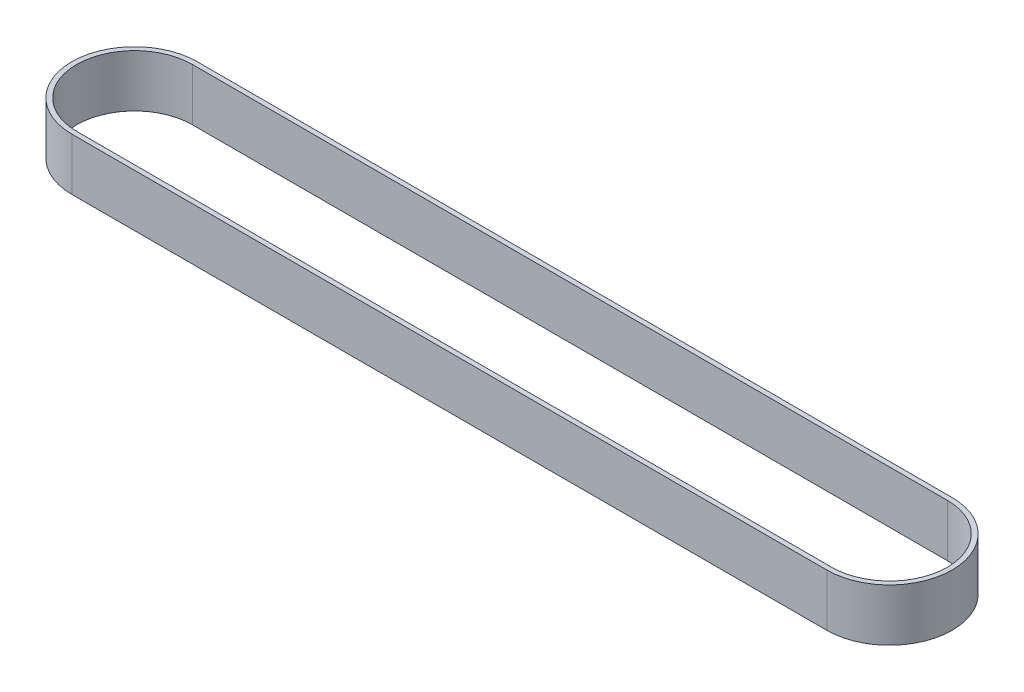
ISO-10303-21;
HEADER;
FILE_DESCRIPTION(('STEP AP214'),'2;1');
FILE_NAME('part.step','',(''),(''),'','','');
FILE_SCHEMA(('AUTOMOTIVE_DESIGN { 1 0 10303 214 1 1 1 1 }'));
ENDSEC;
DATA;
#1=APPLICATION_CONTEXT('core data for automotive mechanical design processes');
#2=APPLICATION_PROTOCOL_DEFINITION('international standard','automotive_design',2000,#1);
#3=PRODUCT_CONTEXT('',#1,'mechanical');
#4=PRODUCT('Part','Part','',(#3));
#5=PRODUCT_RELATED_PRODUCT_CATEGORY('part','',(#4));
#6=PRODUCT_DEFINITION_FORMATION('','',#4);
#7=PRODUCT_DEFINITION_CONTEXT('part definition',#1,'design');
#8=PRODUCT_DEFINITION('design','',#6,#7);
#9=PRODUCT_DEFINITION_SHAPE('','',#8);
#10=(LENGTH_UNIT() NAMED_UNIT(*) SI_UNIT(.MILLI.,.METRE.));
#11=(NAMED_UNIT(*) PLANE_ANGLE_UNIT() SI_UNIT($,.RADIAN.));
#12=(NAMED_UNIT(*) SI_UNIT($,.STERADIAN.) SOLID_ANGLE_UNIT());
#13=UNCERTAINTY_MEASURE_WITH_UNIT(LENGTH_MEASURE(1.E-05),#10,'distance_accuracy_value','');
#14=(GEOMETRIC_REPRESENTATION_CONTEXT(3) GLOBAL_UNCERTAINTY_ASSIGNED_CONTEXT((#13)) GLOBAL_UNIT_ASSIGNED_CONTEXT((#10,
#11,#12)) REPRESENTATION_CONTEXT('',''));
#15=CARTESIAN_POINT('',(0.,0.,0.));
#16=DIRECTION('',(0.,0.,1.));
#17=DIRECTION('',(1.,0.,0.));
#18=AXIS2_PLACEMENT_3D('',#15,#16,#17);
#19=CARTESIAN_POINT('',(144.5,10.,0.));
#20=DIRECTION('',(0.,-1.,0.));
#21=DIRECTION('',(0.,0.,-1.));
#22=AXIS2_PLACEMENT_3D('',#19,#20,#21);
#23=CYLINDRICAL_SURFACE('',#22,11.08);
#24=CARTESIAN_POINT('',(144.5,0.,0.));
#25=DIRECTION('',(0.,1.,0.));
#26=DIRECTION('',(0.,0.,1.));
#27=AXIS2_PLACEMENT_3D('',#24,#25,#26);
#28=CIRCLE('',#27,11.08);
#29=CARTESIAN_POINT('',(144.5,0.,11.08));
#30=VERTEX_POINT('',#29);
#31=CARTESIAN_POINT('',(144.5,0.,-11.08));
#32=VERTEX_POINT('',#31);
#33=EDGE_CURVE('E149',#30,#32,#28,.T.);
#34=ORIENTED_EDGE('',*,*,#33,.F.);
#35=DIRECTION('',(0.,-1.,0.));
#36=VECTOR('',#35,1.);
#37=CARTESIAN_POINT('',(144.5,10.,11.08));
#38=LINE('',#37,#36);
#39=CARTESIAN_POINT('',(144.5,10.,11.08));
#40=VERTEX_POINT('',#39);
#41=EDGE_CURVE('E11',#40,#30,#38,.T.);
#42=ORIENTED_EDGE('',*,*,#41,.F.);
#43=CARTESIAN_POINT('',(144.5,10.,0.));
#44=DIRECTION('',(0.,1.,0.));
#45=DIRECTION('',(0.,0.,1.));
#46=AXIS2_PLACEMENT_3D('',#43,#44,#45);
#47=CIRCLE('',#46,11.08);
#48=CARTESIAN_POINT('',(144.5,10.,-11.08));
#49=VERTEX_POINT('',#48);
#50=EDGE_CURVE('E130',#40,#49,#47,.T.);
#51=ORIENTED_EDGE('',*,*,#50,.T.);
#52=DIRECTION('',(0.,-1.,0.));
#53=VECTOR('',#52,1.);
#54=CARTESIAN_POINT('',(144.5,10.,-11.08));
#55=LINE('',#54,#53);
#56=EDGE_CURVE('E94',#49,#32,#55,.T.);
#57=ORIENTED_EDGE('',*,*,#56,.T.);
#58=EDGE_LOOP('',(#34,#42,#51,#57));
#59=FACE_BOUND('',#58,.T.);
#60=ADVANCED_FACE('F41',(#59),#23,.F.);
#61=CARTESIAN_POINT('',(0.,10.,11.08));
#62=DIRECTION('',(0.,0.,-1.));
#63=DIRECTION('',(-1.,0.,0.));
#64=AXIS2_PLACEMENT_3D('',#61,#62,#63);
#65=PLANE('',#64);
#66=DIRECTION('',(1.,0.,0.));
#67=VECTOR('',#66,1.);
#68=CARTESIAN_POINT('',(0.,0.,11.08));
#69=LINE('',#68,#67);
#70=CARTESIAN_POINT('',(0.,0.,11.08));
#71=VERTEX_POINT('',#70);
#72=EDGE_CURVE('E122',#71,#30,#69,.T.);
#73=ORIENTED_EDGE('',*,*,#72,.F.);
#74=DIRECTION('',(0.,-1.,0.));
#75=VECTOR('',#74,1.);
#76=CARTESIAN_POINT('',(0.,10.,11.08));
#77=LINE('',#76,#75);
#78=CARTESIAN_POINT('',(0.,10.,11.08));
#79=VERTEX_POINT('',#78);
#80=EDGE_CURVE('E51',#79,#71,#77,.T.);
#81=ORIENTED_EDGE('',*,*,#80,.F.);
#82=DIRECTION('',(1.,0.,0.));
#83=VECTOR('',#82,1.);
#84=CARTESIAN_POINT('',(0.,10.,11.08));
#85=LINE('',#84,#83);
#86=EDGE_CURVE('E120',#79,#40,#85,.T.);
#87=ORIENTED_EDGE('',*,*,#86,.T.);
#88=ORIENTED_EDGE('',*,*,#41,.T.);
#89=EDGE_LOOP('',(#73,#81,#87,#88));
#90=FACE_BOUND('',#89,.T.);
#91=ADVANCED_FACE('F119',(#90),#65,.T.);
#92=CARTESIAN_POINT('',(0.,10.,0.));
#93=DIRECTION('',(0.,-1.,0.));
#94=DIRECTION('',(0.,0.,-1.));
#95=AXIS2_PLACEMENT_3D('',#92,#93,#94);
#96=CYLINDRICAL_SURFACE('',#95,11.08);
#97=CARTESIAN_POINT('',(0.,0.,0.));
#98=DIRECTION('',(0.,1.,0.));
#99=DIRECTION('',(0.,0.,1.));
#100=AXIS2_PLACEMENT_3D('',#97,#98,#99);
#101=CIRCLE('',#100,11.08);
#102=CARTESIAN_POINT('',(0.,0.,-11.08));
#103=VERTEX_POINT('',#102);
#104=EDGE_CURVE('E153',#103,#71,#101,.T.);
#105=ORIENTED_EDGE('',*,*,#104,.F.);
#106=DIRECTION('',(0.,-1.,0.));
#107=VECTOR('',#106,1.);
#108=CARTESIAN_POINT('',(0.,10.,-11.08));
#109=LINE('',#108,#107);
#110=CARTESIAN_POINT('',(0.,10.,-11.08));
#111=VERTEX_POINT('',#110);
#112=EDGE_CURVE('E87',#111,#103,#109,.T.);
#113=ORIENTED_EDGE('',*,*,#112,.F.);
#114=CARTESIAN_POINT('',(0.,10.,0.));
#115=DIRECTION('',(0.,1.,0.));
#116=DIRECTION('',(0.,0.,1.));
#117=AXIS2_PLACEMENT_3D('',#114,#115,#116);
#118=CIRCLE('',#117,11.08);
#119=EDGE_CURVE('E129',#111,#79,#118,.T.);
#120=ORIENTED_EDGE('',*,*,#119,.T.);
#121=ORIENTED_EDGE('',*,*,#80,.T.);
#122=EDGE_LOOP('',(#105,#113,#120,#121));
#123=FACE_BOUND('',#122,.T.);
#124=ADVANCED_FACE('F132',(#123),#96,.F.);
#125=CARTESIAN_POINT('',(0.,10.,0.));
#126=DIRECTION('',(0.,-1.,0.));
#127=DIRECTION('',(0.,0.,-1.));
#128=AXIS2_PLACEMENT_3D('',#125,#126,#127);
#129=CYLINDRICAL_SURFACE('',#128,12.);
#130=CARTESIAN_POINT('',(0.,0.,0.));
#131=DIRECTION('',(0.,1.,0.));
#132=DIRECTION('',(0.,0.,1.));
#133=AXIS2_PLACEMENT_3D('',#130,#131,#132);
#134=CIRCLE('',#133,12.);
#135=CARTESIAN_POINT('',(0.,0.,-12.));
#136=VERTEX_POINT('',#135);
#137=CARTESIAN_POINT('',(0.,0.,12.));
#138=VERTEX_POINT('',#137);
#139=EDGE_CURVE('E138',#136,#138,#134,.T.);
#140=ORIENTED_EDGE('',*,*,#139,.T.);
#141=DIRECTION('',(0.,-1.,0.));
#142=VECTOR('',#141,1.);
#143=CARTESIAN_POINT('',(0.,10.,12.));
#144=LINE('',#143,#142);
#145=CARTESIAN_POINT('',(0.,10.,12.));
#146=VERTEX_POINT('',#145);
#147=EDGE_CURVE('E45',#146,#138,#144,.T.);
#148=ORIENTED_EDGE('',*,*,#147,.F.);
#149=CARTESIAN_POINT('',(0.,10.,0.));
#150=DIRECTION('',(0.,1.,0.));
#151=DIRECTION('',(0.,0.,1.));
#152=AXIS2_PLACEMENT_3D('',#149,#150,#151);
#153=CIRCLE('',#152,12.);
#154=CARTESIAN_POINT('',(0.,10.,-12.));
#155=VERTEX_POINT('',#154);
#156=EDGE_CURVE('E157',#155,#146,#153,.T.);
#157=ORIENTED_EDGE('',*,*,#156,.F.);
#158=DIRECTION('',(0.,-1.,0.));
#159=VECTOR('',#158,1.);
#160=CARTESIAN_POINT('',(0.,10.,-12.));
#161=LINE('',#160,#159);
#162=EDGE_CURVE('E134',#155,#136,#161,.T.);
#163=ORIENTED_EDGE('',*,*,#162,.T.);
#164=EDGE_LOOP('',(#140,#148,#157,#163));
#165=FACE_BOUND('',#164,.T.);
#166=ADVANCED_FACE('F43',(#165),#129,.T.);
#167=CARTESIAN_POINT('',(0.,10.,12.));
#168=DIRECTION('',(0.,0.,-1.));
#169=DIRECTION('',(-1.,0.,0.));
#170=AXIS2_PLACEMENT_3D('',#167,#168,#169);
#171=PLANE('',#170);
#172=DIRECTION('',(1.,0.,0.));
#173=VECTOR('',#172,1.);
#174=CARTESIAN_POINT('',(0.,0.,12.));
#175=LINE('',#174,#173);
#176=CARTESIAN_POINT('',(144.5,0.,12.));
#177=VERTEX_POINT('',#176);
#178=EDGE_CURVE('E141',#138,#177,#175,.T.);
#179=ORIENTED_EDGE('',*,*,#178,.T.);
#180=DIRECTION('',(0.,-1.,0.));
#181=VECTOR('',#180,1.);
#182=CARTESIAN_POINT('',(144.5,10.,12.));
#183=LINE('',#182,#181);
#184=CARTESIAN_POINT('',(144.5,10.,12.));
#185=VERTEX_POINT('',#184);
#186=EDGE_CURVE('E162',#185,#177,#183,.T.);
#187=ORIENTED_EDGE('',*,*,#186,.F.);
#188=DIRECTION('',(1.,0.,0.));
#189=VECTOR('',#188,1.);
#190=CARTESIAN_POINT('',(0.,10.,12.));
#191=LINE('',#190,#189);
#192=EDGE_CURVE('E102',#146,#185,#191,.T.);
#193=ORIENTED_EDGE('',*,*,#192,.F.);
#194=ORIENTED_EDGE('',*,*,#147,.T.);
#195=EDGE_LOOP('',(#179,#187,#193,#194));
#196=FACE_BOUND('',#195,.T.);
#197=ADVANCED_FACE('F168',(#196),#171,.F.);
#198=CARTESIAN_POINT('',(144.5,10.,0.));
#199=DIRECTION('',(0.,-1.,0.));
#200=DIRECTION('',(0.,0.,-1.));
#201=AXIS2_PLACEMENT_3D('',#198,#199,#200);
#202=CYLINDRICAL_SURFACE('',#201,12.);
#203=CARTESIAN_POINT('',(144.5,0.,0.));
#204=DIRECTION('',(0.,1.,0.));
#205=DIRECTION('',(0.,0.,1.));
#206=AXIS2_PLACEMENT_3D('',#203,#204,#205);
#207=CIRCLE('',#206,12.);
#208=CARTESIAN_POINT('',(144.5,0.,-12.));
#209=VERTEX_POINT('',#208);
#210=EDGE_CURVE('E143',#177,#209,#207,.T.);
#211=ORIENTED_EDGE('',*,*,#210,.T.);
#212=DIRECTION('',(0.,-1.,0.));
#213=VECTOR('',#212,1.);
#214=CARTESIAN_POINT('',(144.5,10.,-12.));
#215=LINE('',#214,#213);
#216=CARTESIAN_POINT('',(144.5,10.,-12.));
#217=VERTEX_POINT('',#216);
#218=EDGE_CURVE('E161',#217,#209,#215,.T.);
#219=ORIENTED_EDGE('',*,*,#218,.F.);
#220=CARTESIAN_POINT('',(144.5,10.,0.));
#221=DIRECTION('',(0.,1.,0.));
#222=DIRECTION('',(0.,0.,1.));
#223=AXIS2_PLACEMENT_3D('',#220,#221,#222);
#224=CIRCLE('',#223,12.);
#225=EDGE_CURVE('E209',#185,#217,#224,.T.);
#226=ORIENTED_EDGE('',*,*,#225,.F.);
#227=ORIENTED_EDGE('',*,*,#186,.T.);
#228=EDGE_LOOP('',(#211,#219,#226,#227));
#229=FACE_BOUND('',#228,.T.);
#230=ADVANCED_FACE('F182',(#229),#202,.T.);
#231=CARTESIAN_POINT('',(0.,10.,-12.));
#232=DIRECTION('',(0.,0.,-1.));
#233=DIRECTION('',(-1.,0.,0.));
#234=AXIS2_PLACEMENT_3D('',#231,#232,#233);
#235=PLANE('',#234);
#236=DIRECTION('',(1.,0.,0.));
#237=VECTOR('',#236,1.);
#238=CARTESIAN_POINT('',(0.,0.,-12.));
#239=LINE('',#238,#237);
#240=EDGE_CURVE('E146',#136,#209,#239,.T.);
#241=ORIENTED_EDGE('',*,*,#240,.F.);
#242=ORIENTED_EDGE('',*,*,#162,.F.);
#243=DIRECTION('',(1.,0.,0.));
#244=VECTOR('',#243,1.);
#245=CARTESIAN_POINT('',(0.,10.,-12.));
#246=LINE('',#245,#244);
#247=EDGE_CURVE('E181',#155,#217,#246,.T.);
#248=ORIENTED_EDGE('',*,*,#247,.T.);
#249=ORIENTED_EDGE('',*,*,#218,.T.);
#250=EDGE_LOOP('',(#241,#242,#248,#249));
#251=FACE_BOUND('',#250,.T.);
#252=ADVANCED_FACE('F177',(#251),#235,.T.);
#253=CARTESIAN_POINT('',(0.,10.,-11.08));
#254=DIRECTION('',(0.,0.,-1.));
#255=DIRECTION('',(-1.,0.,0.));
#256=AXIS2_PLACEMENT_3D('',#253,#254,#255);
#257=PLANE('',#256);
#258=DIRECTION('',(1.,0.,0.));
#259=VECTOR('',#258,1.);
#260=CARTESIAN_POINT('',(0.,0.,-11.08));
#261=LINE('',#260,#259);
#262=EDGE_CURVE('E155',#103,#32,#261,.T.);
#263=ORIENTED_EDGE('',*,*,#262,.T.);
#264=ORIENTED_EDGE('',*,*,#56,.F.);
#265=DIRECTION('',(1.,0.,0.));
#266=VECTOR('',#265,1.);
#267=CARTESIAN_POINT('',(0.,10.,-11.08));
#268=LINE('',#267,#266);
#269=EDGE_CURVE('E60',#111,#49,#268,.T.);
#270=ORIENTED_EDGE('',*,*,#269,.F.);
#271=ORIENTED_EDGE('',*,*,#112,.T.);
#272=EDGE_LOOP('',(#263,#264,#270,#271));
#273=FACE_BOUND('',#272,.T.);
#274=ADVANCED_FACE('F189',(#273),#257,.F.);
#275=CARTESIAN_POINT('',(0.,10.,0.));
#276=DIRECTION('',(0.,1.,0.));
#277=DIRECTION('',(0.,0.,1.));
#278=AXIS2_PLACEMENT_3D('',#275,#276,#277);
#279=PLANE('',#278);
#280=ORIENTED_EDGE('',*,*,#156,.T.);
#281=ORIENTED_EDGE('',*,*,#192,.T.);
#282=ORIENTED_EDGE('',*,*,#225,.T.);
#283=ORIENTED_EDGE('',*,*,#247,.F.);
#284=EDGE_LOOP('',(#280,#281,#282,#283));
#285=FACE_BOUND('',#284,.T.);
#286=ORIENTED_EDGE('',*,*,#50,.F.);
#287=ORIENTED_EDGE('',*,*,#86,.F.);
#288=ORIENTED_EDGE('',*,*,#119,.F.);
#289=ORIENTED_EDGE('',*,*,#269,.T.);
#290=EDGE_LOOP('',(#286,#287,#288,#289));
#291=FACE_BOUND('',#290,.T.);
#292=ADVANCED_FACE('F128',(#285,#291),#279,.T.);
#293=CARTESIAN_POINT('',(0.,0.,0.));
#294=DIRECTION('',(0.,1.,0.));
#295=DIRECTION('',(0.,0.,1.));
#296=AXIS2_PLACEMENT_3D('',#293,#294,#295);
#297=PLANE('',#296);
#298=ORIENTED_EDGE('',*,*,#139,.F.);
#299=ORIENTED_EDGE('',*,*,#240,.T.);
#300=ORIENTED_EDGE('',*,*,#210,.F.);
#301=ORIENTED_EDGE('',*,*,#178,.F.);
#302=EDGE_LOOP('',(#298,#299,#300,#301));
#303=FACE_BOUND('',#302,.T.);
#304=ORIENTED_EDGE('',*,*,#33,.T.);
#305=ORIENTED_EDGE('',*,*,#262,.F.);
#306=ORIENTED_EDGE('',*,*,#104,.T.);
#307=ORIENTED_EDGE('',*,*,#72,.T.);
#308=EDGE_LOOP('',(#304,#305,#306,#307));
#309=FACE_BOUND('',#308,.T.);
#310=ADVANCED_FACE('F174',(#303,#309),#297,.F.);
#311=CLOSED_SHELL('',(#60,#91,#124,#166,#197,#230,#252,#274,#292,#310));
#312=MANIFOLD_SOLID_BREP('B2',#311);
#313=ADVANCED_BREP_SHAPE_REPRESENTATION('',(#18,#312),#14);
#314=SHAPE_DEFINITION_REPRESENTATION(#9,#313);
ENDSEC;
END-ISO-10303-21;
